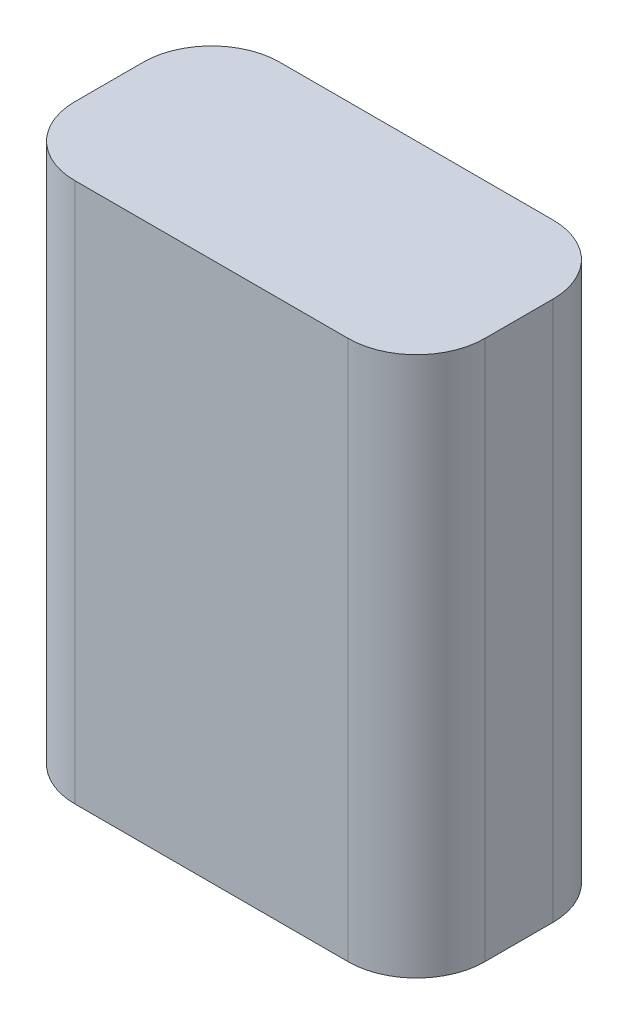
ISO-10303-21;
HEADER;
FILE_DESCRIPTION(('STEP AP214'),'2;1');
FILE_NAME('part.step','',(''),(''),'','','');
FILE_SCHEMA(('AUTOMOTIVE_DESIGN { 1 0 10303 214 1 1 1 1 }'));
ENDSEC;
DATA;
#1=APPLICATION_CONTEXT('core data for automotive mechanical design processes');
#2=APPLICATION_PROTOCOL_DEFINITION('international standard','automotive_design',2000,#1);
#3=PRODUCT_CONTEXT('',#1,'mechanical');
#4=PRODUCT('Part','Part','',(#3));
#5=PRODUCT_RELATED_PRODUCT_CATEGORY('part','',(#4));
#6=PRODUCT_DEFINITION_FORMATION('','',#4);
#7=PRODUCT_DEFINITION_CONTEXT('part definition',#1,'design');
#8=PRODUCT_DEFINITION('design','',#6,#7);
#9=PRODUCT_DEFINITION_SHAPE('','',#8);
#10=(LENGTH_UNIT() NAMED_UNIT(*) SI_UNIT(.MILLI.,.METRE.));
#11=(NAMED_UNIT(*) PLANE_ANGLE_UNIT() SI_UNIT($,.RADIAN.));
#12=(NAMED_UNIT(*) SI_UNIT($,.STERADIAN.) SOLID_ANGLE_UNIT());
#13=UNCERTAINTY_MEASURE_WITH_UNIT(LENGTH_MEASURE(1.E-05),#10,'distance_accuracy_value','');
#14=(GEOMETRIC_REPRESENTATION_CONTEXT(3) GLOBAL_UNCERTAINTY_ASSIGNED_CONTEXT((#13)) GLOBAL_UNIT_ASSIGNED_CONTEXT((#10,
#11,#12)) REPRESENTATION_CONTEXT('',''));
#15=CARTESIAN_POINT('',(0.,0.,0.));
#16=DIRECTION('',(0.,0.,1.));
#17=DIRECTION('',(1.,0.,0.));
#18=AXIS2_PLACEMENT_3D('',#15,#16,#17);
#19=CARTESIAN_POINT('',(-5.,19.75,-1.25));
#20=DIRECTION('',(0.,-1.,0.));
#21=DIRECTION('',(0.,0.,-1.));
#22=AXIS2_PLACEMENT_3D('',#19,#20,#21);
#23=CYLINDRICAL_SURFACE('',#22,2.5);
#24=CARTESIAN_POINT('',(-5.,0.,-1.25));
#25=DIRECTION('',(0.,1.,0.));
#26=DIRECTION('',(0.,0.,1.));
#27=AXIS2_PLACEMENT_3D('',#24,#25,#26);
#28=CIRCLE('',#27,2.5);
#29=CARTESIAN_POINT('',(-4.99999999999998,0.,-3.75));
#30=VERTEX_POINT('',#29);
#31=CARTESIAN_POINT('',(-7.5,0.,-1.24999999999998));
#32=VERTEX_POINT('',#31);
#33=EDGE_CURVE('E126',#30,#32,#28,.T.);
#34=ORIENTED_EDGE('',*,*,#33,.T.);
#35=DIRECTION('',(0.,-1.,0.));
#36=VECTOR('',#35,1.);
#37=CARTESIAN_POINT('',(-7.5,19.75,-1.24999999999998));
#38=LINE('',#37,#36);
#39=CARTESIAN_POINT('',(-7.5,19.75,-1.24999999999998));
#40=VERTEX_POINT('',#39);
#41=EDGE_CURVE('E11',#40,#32,#38,.T.);
#42=ORIENTED_EDGE('',*,*,#41,.F.);
#43=CARTESIAN_POINT('',(-5.,19.75,-1.25));
#44=DIRECTION('',(0.,1.,0.));
#45=DIRECTION('',(0.,0.,1.));
#46=AXIS2_PLACEMENT_3D('',#43,#44,#45);
#47=CIRCLE('',#46,2.5);
#48=CARTESIAN_POINT('',(-4.99999999999998,19.75,-3.75));
#49=VERTEX_POINT('',#48);
#50=EDGE_CURVE('E140',#49,#40,#47,.T.);
#51=ORIENTED_EDGE('',*,*,#50,.F.);
#52=DIRECTION('',(0.,-1.,0.));
#53=VECTOR('',#52,1.);
#54=CARTESIAN_POINT('',(-4.99999999999998,19.75,-3.75));
#55=LINE('',#54,#53);
#56=EDGE_CURVE('E122',#49,#30,#55,.T.);
#57=ORIENTED_EDGE('',*,*,#56,.T.);
#58=EDGE_LOOP('',(#34,#42,#51,#57));
#59=FACE_BOUND('',#58,.T.);
#60=ADVANCED_FACE('F30',(#59),#23,.T.);
#61=CARTESIAN_POINT('',(-7.5,19.75,-1.24999999999998));
#62=DIRECTION('',(1.,0.,0.));
#63=DIRECTION('',(0.,0.,-1.));
#64=AXIS2_PLACEMENT_3D('',#61,#62,#63);
#65=PLANE('',#64);
#66=DIRECTION('',(0.,0.,1.));
#67=VECTOR('',#66,1.);
#68=CARTESIAN_POINT('',(-7.5,0.,-1.24999999999998));
#69=LINE('',#68,#67);
#70=CARTESIAN_POINT('',(-7.5,0.,1.24999999999998));
#71=VERTEX_POINT('',#70);
#72=EDGE_CURVE('E129',#32,#71,#69,.T.);
#73=ORIENTED_EDGE('',*,*,#72,.T.);
#74=DIRECTION('',(0.,-1.,0.));
#75=VECTOR('',#74,1.);
#76=CARTESIAN_POINT('',(-7.5,19.75,1.24999999999998));
#77=LINE('',#76,#75);
#78=CARTESIAN_POINT('',(-7.5,19.75,1.24999999999998));
#79=VERTEX_POINT('',#78);
#80=EDGE_CURVE('E38',#79,#71,#77,.T.);
#81=ORIENTED_EDGE('',*,*,#80,.F.);
#82=DIRECTION('',(0.,0.,1.));
#83=VECTOR('',#82,1.);
#84=CARTESIAN_POINT('',(-7.5,19.75,-1.24999999999998));
#85=LINE('',#84,#83);
#86=EDGE_CURVE('E89',#40,#79,#85,.T.);
#87=ORIENTED_EDGE('',*,*,#86,.F.);
#88=ORIENTED_EDGE('',*,*,#41,.T.);
#89=EDGE_LOOP('',(#73,#81,#87,#88));
#90=FACE_BOUND('',#89,.T.);
#91=ADVANCED_FACE('F175',(#90),#65,.F.);
#92=CARTESIAN_POINT('',(-5.,19.75,1.25));
#93=DIRECTION('',(0.,-1.,0.));
#94=DIRECTION('',(0.,0.,-1.));
#95=AXIS2_PLACEMENT_3D('',#92,#93,#94);
#96=CYLINDRICAL_SURFACE('',#95,2.5);
#97=CARTESIAN_POINT('',(-5.,0.,1.25));
#98=DIRECTION('',(0.,1.,0.));
#99=DIRECTION('',(0.,0.,1.));
#100=AXIS2_PLACEMENT_3D('',#97,#98,#99);
#101=CIRCLE('',#100,2.5);
#102=CARTESIAN_POINT('',(-4.99999999999998,0.,3.75));
#103=VERTEX_POINT('',#102);
#104=EDGE_CURVE('E131',#71,#103,#101,.T.);
#105=ORIENTED_EDGE('',*,*,#104,.T.);
#106=DIRECTION('',(0.,-1.,0.));
#107=VECTOR('',#106,1.);
#108=CARTESIAN_POINT('',(-4.99999999999998,19.75,3.75));
#109=LINE('',#108,#107);
#110=CARTESIAN_POINT('',(-4.99999999999998,19.75,3.75));
#111=VERTEX_POINT('',#110);
#112=EDGE_CURVE('E147',#111,#103,#109,.T.);
#113=ORIENTED_EDGE('',*,*,#112,.F.);
#114=CARTESIAN_POINT('',(-5.,19.75,1.25));
#115=DIRECTION('',(0.,1.,0.));
#116=DIRECTION('',(0.,0.,1.));
#117=AXIS2_PLACEMENT_3D('',#114,#115,#116);
#118=CIRCLE('',#117,2.5);
#119=EDGE_CURVE('E155',#79,#111,#118,.T.);
#120=ORIENTED_EDGE('',*,*,#119,.F.);
#121=ORIENTED_EDGE('',*,*,#80,.T.);
#122=EDGE_LOOP('',(#105,#113,#120,#121));
#123=FACE_BOUND('',#122,.T.);
#124=ADVANCED_FACE('F153',(#123),#96,.T.);
#125=CARTESIAN_POINT('',(-4.99999999999998,19.75,3.75));
#126=DIRECTION('',(0.,0.,-1.));
#127=DIRECTION('',(-1.,0.,0.));
#128=AXIS2_PLACEMENT_3D('',#125,#126,#127);
#129=PLANE('',#128);
#130=DIRECTION('',(1.,0.,0.));
#131=VECTOR('',#130,1.);
#132=CARTESIAN_POINT('',(-4.99999999999998,0.,3.75));
#133=LINE('',#132,#131);
#134=CARTESIAN_POINT('',(4.99999999999998,0.,3.75));
#135=VERTEX_POINT('',#134);
#136=EDGE_CURVE('E133',#103,#135,#133,.T.);
#137=ORIENTED_EDGE('',*,*,#136,.T.);
#138=DIRECTION('',(0.,-1.,0.));
#139=VECTOR('',#138,1.);
#140=CARTESIAN_POINT('',(4.99999999999998,19.75,3.75));
#141=LINE('',#140,#139);
#142=CARTESIAN_POINT('',(4.99999999999998,19.75,3.75));
#143=VERTEX_POINT('',#142);
#144=EDGE_CURVE('E144',#143,#135,#141,.T.);
#145=ORIENTED_EDGE('',*,*,#144,.F.);
#146=DIRECTION('',(1.,0.,0.));
#147=VECTOR('',#146,1.);
#148=CARTESIAN_POINT('',(-4.99999999999998,19.75,3.75));
#149=LINE('',#148,#147);
#150=EDGE_CURVE('E167',#111,#143,#149,.T.);
#151=ORIENTED_EDGE('',*,*,#150,.F.);
#152=ORIENTED_EDGE('',*,*,#112,.T.);
#153=EDGE_LOOP('',(#137,#145,#151,#152));
#154=FACE_BOUND('',#153,.T.);
#155=ADVANCED_FACE('F163',(#154),#129,.F.);
#156=CARTESIAN_POINT('',(5.,19.75,1.25));
#157=DIRECTION('',(0.,-1.,0.));
#158=DIRECTION('',(0.,0.,-1.));
#159=AXIS2_PLACEMENT_3D('',#156,#157,#158);
#160=CYLINDRICAL_SURFACE('',#159,2.5);
#161=CARTESIAN_POINT('',(5.,0.,1.25));
#162=DIRECTION('',(0.,1.,0.));
#163=DIRECTION('',(0.,0.,1.));
#164=AXIS2_PLACEMENT_3D('',#161,#162,#163);
#165=CIRCLE('',#164,2.5);
#166=CARTESIAN_POINT('',(7.5,0.,1.24999999999998));
#167=VERTEX_POINT('',#166);
#168=EDGE_CURVE('E135',#135,#167,#165,.T.);
#169=ORIENTED_EDGE('',*,*,#168,.T.);
#170=DIRECTION('',(0.,-1.,0.));
#171=VECTOR('',#170,1.);
#172=CARTESIAN_POINT('',(7.5,19.75,1.24999999999998));
#173=LINE('',#172,#171);
#174=CARTESIAN_POINT('',(7.5,19.75,1.24999999999998));
#175=VERTEX_POINT('',#174);
#176=EDGE_CURVE('E117',#175,#167,#173,.T.);
#177=ORIENTED_EDGE('',*,*,#176,.F.);
#178=CARTESIAN_POINT('',(5.,19.75,1.25));
#179=DIRECTION('',(0.,1.,0.));
#180=DIRECTION('',(0.,0.,1.));
#181=AXIS2_PLACEMENT_3D('',#178,#179,#180);
#182=CIRCLE('',#181,2.5);
#183=EDGE_CURVE('E108',#143,#175,#182,.T.);
#184=ORIENTED_EDGE('',*,*,#183,.F.);
#185=ORIENTED_EDGE('',*,*,#144,.T.);
#186=EDGE_LOOP('',(#169,#177,#184,#185));
#187=FACE_BOUND('',#186,.T.);
#188=ADVANCED_FACE('F166',(#187),#160,.T.);
#189=CARTESIAN_POINT('',(7.5,19.75,-1.24999999999998));
#190=DIRECTION('',(-1.,0.,0.));
#191=DIRECTION('',(0.,0.,1.));
#192=AXIS2_PLACEMENT_3D('',#189,#190,#191);
#193=PLANE('',#192);
#194=DIRECTION('',(0.,0.,-1.));
#195=VECTOR('',#194,1.);
#196=CARTESIAN_POINT('',(7.5,0.,-1.24999999999998));
#197=LINE('',#196,#195);
#198=CARTESIAN_POINT('',(7.5,0.,-1.24999999999998));
#199=VERTEX_POINT('',#198);
#200=EDGE_CURVE('E116',#167,#199,#197,.T.);
#201=ORIENTED_EDGE('',*,*,#200,.T.);
#202=DIRECTION('',(0.,-1.,0.));
#203=VECTOR('',#202,1.);
#204=CARTESIAN_POINT('',(7.5,19.75,-1.24999999999998));
#205=LINE('',#204,#203);
#206=CARTESIAN_POINT('',(7.5,19.75,-1.24999999999998));
#207=VERTEX_POINT('',#206);
#208=EDGE_CURVE('E113',#207,#199,#205,.T.);
#209=ORIENTED_EDGE('',*,*,#208,.F.);
#210=DIRECTION('',(0.,0.,-1.));
#211=VECTOR('',#210,1.);
#212=CARTESIAN_POINT('',(7.5,19.75,-1.24999999999998));
#213=LINE('',#212,#211);
#214=EDGE_CURVE('E102',#175,#207,#213,.T.);
#215=ORIENTED_EDGE('',*,*,#214,.F.);
#216=ORIENTED_EDGE('',*,*,#176,.T.);
#217=EDGE_LOOP('',(#201,#209,#215,#216));
#218=FACE_BOUND('',#217,.T.);
#219=ADVANCED_FACE('F114',(#218),#193,.F.);
#220=CARTESIAN_POINT('',(5.,19.75,-1.25));
#221=DIRECTION('',(0.,-1.,0.));
#222=DIRECTION('',(0.,0.,-1.));
#223=AXIS2_PLACEMENT_3D('',#220,#221,#222);
#224=CYLINDRICAL_SURFACE('',#223,2.5);
#225=CARTESIAN_POINT('',(5.,0.,-1.25));
#226=DIRECTION('',(0.,1.,0.));
#227=DIRECTION('',(0.,0.,-1.));
#228=AXIS2_PLACEMENT_3D('',#225,#226,#227);
#229=CIRCLE('',#228,2.5);
#230=CARTESIAN_POINT('',(4.99999999999998,0.,-3.75));
#231=VERTEX_POINT('',#230);
#232=EDGE_CURVE('E75',#199,#231,#229,.T.);
#233=ORIENTED_EDGE('',*,*,#232,.T.);
#234=DIRECTION('',(0.,-1.,0.));
#235=VECTOR('',#234,1.);
#236=CARTESIAN_POINT('',(4.99999999999998,19.75,-3.75));
#237=LINE('',#236,#235);
#238=CARTESIAN_POINT('',(4.99999999999998,19.75,-3.75));
#239=VERTEX_POINT('',#238);
#240=EDGE_CURVE('E118',#239,#231,#237,.T.);
#241=ORIENTED_EDGE('',*,*,#240,.F.);
#242=CARTESIAN_POINT('',(5.,19.75,-1.25));
#243=DIRECTION('',(0.,1.,0.));
#244=DIRECTION('',(0.,0.,-1.));
#245=AXIS2_PLACEMENT_3D('',#242,#243,#244);
#246=CIRCLE('',#245,2.5);
#247=EDGE_CURVE('E106',#207,#239,#246,.T.);
#248=ORIENTED_EDGE('',*,*,#247,.F.);
#249=ORIENTED_EDGE('',*,*,#208,.T.);
#250=EDGE_LOOP('',(#233,#241,#248,#249));
#251=FACE_BOUND('',#250,.T.);
#252=ADVANCED_FACE('F120',(#251),#224,.T.);
#253=CARTESIAN_POINT('',(-4.99999999999998,19.75,-3.75));
#254=DIRECTION('',(0.,0.,1.));
#255=DIRECTION('',(1.,0.,0.));
#256=AXIS2_PLACEMENT_3D('',#253,#254,#255);
#257=PLANE('',#256);
#258=DIRECTION('',(-1.,0.,0.));
#259=VECTOR('',#258,1.);
#260=CARTESIAN_POINT('',(-4.99999999999998,0.,-3.75));
#261=LINE('',#260,#259);
#262=EDGE_CURVE('E81',#231,#30,#261,.T.);
#263=ORIENTED_EDGE('',*,*,#262,.T.);
#264=ORIENTED_EDGE('',*,*,#56,.F.);
#265=DIRECTION('',(-1.,0.,0.));
#266=VECTOR('',#265,1.);
#267=CARTESIAN_POINT('',(-4.99999999999998,19.75,-3.75));
#268=LINE('',#267,#266);
#269=EDGE_CURVE('E46',#239,#49,#268,.T.);
#270=ORIENTED_EDGE('',*,*,#269,.F.);
#271=ORIENTED_EDGE('',*,*,#240,.T.);
#272=EDGE_LOOP('',(#263,#264,#270,#271));
#273=FACE_BOUND('',#272,.T.);
#274=ADVANCED_FACE('F191',(#273),#257,.F.);
#275=CARTESIAN_POINT('',(-5.,19.75,-1.25));
#276=DIRECTION('',(0.,1.,0.));
#277=DIRECTION('',(0.,0.,1.));
#278=AXIS2_PLACEMENT_3D('',#275,#276,#277);
#279=PLANE('',#278);
#280=ORIENTED_EDGE('',*,*,#50,.T.);
#281=ORIENTED_EDGE('',*,*,#86,.T.);
#282=ORIENTED_EDGE('',*,*,#119,.T.);
#283=ORIENTED_EDGE('',*,*,#150,.T.);
#284=ORIENTED_EDGE('',*,*,#183,.T.);
#285=ORIENTED_EDGE('',*,*,#214,.T.);
#286=ORIENTED_EDGE('',*,*,#247,.T.);
#287=ORIENTED_EDGE('',*,*,#269,.T.);
#288=EDGE_LOOP('',(#280,#281,#282,#283,#284,#285,#286,#287));
#289=FACE_BOUND('',#288,.T.);
#290=ADVANCED_FACE('F104',(#289),#279,.T.);
#291=CARTESIAN_POINT('',(-5.,0.,-1.25));
#292=DIRECTION('',(0.,1.,0.));
#293=DIRECTION('',(0.,0.,1.));
#294=AXIS2_PLACEMENT_3D('',#291,#292,#293);
#295=PLANE('',#294);
#296=ORIENTED_EDGE('',*,*,#33,.F.);
#297=ORIENTED_EDGE('',*,*,#262,.F.);
#298=ORIENTED_EDGE('',*,*,#232,.F.);
#299=ORIENTED_EDGE('',*,*,#200,.F.);
#300=ORIENTED_EDGE('',*,*,#168,.F.);
#301=ORIENTED_EDGE('',*,*,#136,.F.);
#302=ORIENTED_EDGE('',*,*,#104,.F.);
#303=ORIENTED_EDGE('',*,*,#72,.F.);
#304=EDGE_LOOP('',(#296,#297,#298,#299,#300,#301,#302,#303));
#305=FACE_BOUND('',#304,.T.);
#306=ADVANCED_FACE('F159',(#305),#295,.F.);
#307=CLOSED_SHELL('',(#60,#91,#124,#155,#188,#219,#252,#274,#290,#306));
#308=MANIFOLD_SOLID_BREP('B2',#307);
#309=ADVANCED_BREP_SHAPE_REPRESENTATION('',(#18,#308),#14);
#310=SHAPE_DEFINITION_REPRESENTATION(#9,#309);
ENDSEC;
END-ISO-10303-21;
